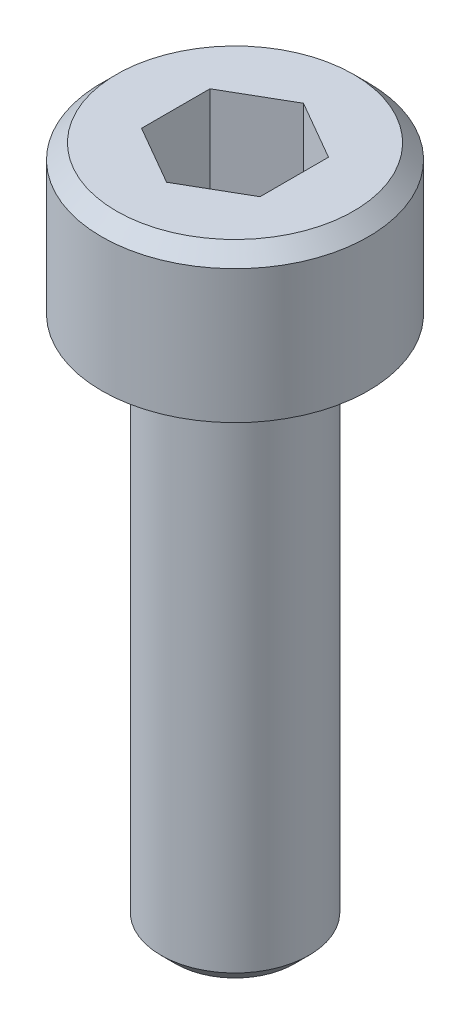
ISO-10303-21;
HEADER;
FILE_DESCRIPTION(('STEP AP214'),'2;1');
FILE_NAME('part.step','',(''),(''),'','','');
FILE_SCHEMA(('AUTOMOTIVE_DESIGN { 1 0 10303 214 1 1 1 1 }'));
ENDSEC;
DATA;
#1=APPLICATION_CONTEXT('core data for automotive mechanical design processes');
#2=APPLICATION_PROTOCOL_DEFINITION('international standard','automotive_design',2000,#1);
#3=PRODUCT_CONTEXT('',#1,'mechanical');
#4=PRODUCT('Part','Part','',(#3));
#5=PRODUCT_RELATED_PRODUCT_CATEGORY('part','',(#4));
#6=PRODUCT_DEFINITION_FORMATION('','',#4);
#7=PRODUCT_DEFINITION_CONTEXT('part definition',#1,'design');
#8=PRODUCT_DEFINITION('design','',#6,#7);
#9=PRODUCT_DEFINITION_SHAPE('','',#8);
#10=(LENGTH_UNIT() NAMED_UNIT(*) SI_UNIT(.MILLI.,.METRE.));
#11=(NAMED_UNIT(*) PLANE_ANGLE_UNIT() SI_UNIT($,.RADIAN.));
#12=(NAMED_UNIT(*) SI_UNIT($,.STERADIAN.) SOLID_ANGLE_UNIT());
#13=UNCERTAINTY_MEASURE_WITH_UNIT(LENGTH_MEASURE(1.E-05),#10,'distance_accuracy_value','');
#14=(GEOMETRIC_REPRESENTATION_CONTEXT(3) GLOBAL_UNCERTAINTY_ASSIGNED_CONTEXT((#13)) GLOBAL_UNIT_ASSIGNED_CONTEXT((#10,
#11,#12)) REPRESENTATION_CONTEXT('',''));
#15=CARTESIAN_POINT('',(0.,0.,0.));
#16=DIRECTION('',(0.,0.,1.));
#17=DIRECTION('',(1.,0.,0.));
#18=AXIS2_PLACEMENT_3D('',#15,#16,#17);
#19=CARTESIAN_POINT('',(0.,11.5,0.));
#20=DIRECTION('',(0.,-1.,0.));
#21=DIRECTION('',(0.,0.,-1.));
#22=AXIS2_PLACEMENT_3D('',#19,#20,#21);
#23=PLANE('',#22);
#24=CARTESIAN_POINT('',(0.,11.5,0.));
#25=DIRECTION('',(0.,-1.,0.));
#26=DIRECTION('',(0.,0.,-1.));
#27=AXIS2_PLACEMENT_3D('',#24,#25,#26);
#28=CIRCLE('',#27,4.);
#29=CARTESIAN_POINT('',(0.,11.5,-4.));
#30=VERTEX_POINT('',#29);
#31=EDGE_CURVE('E145',#30,#30,#28,.F.);
#32=ORIENTED_EDGE('',*,*,#31,.T.);
#33=EDGE_LOOP('',(#32));
#34=FACE_BOUND('',#33,.T.);
#35=DIRECTION('',(-0.866025403784439,0.,0.5));
#36=VECTOR('',#35,1.);
#37=CARTESIAN_POINT('',(0.,11.5,-2.3094010767585));
#38=LINE('',#37,#36);
#39=CARTESIAN_POINT('',(0.,11.5,-2.3094010767585));
#40=VERTEX_POINT('',#39);
#41=CARTESIAN_POINT('',(-2.,11.5,-1.15470053837925));
#42=VERTEX_POINT('',#41);
#43=EDGE_CURVE('E121',#40,#42,#38,.T.);
#44=ORIENTED_EDGE('',*,*,#43,.F.);
#45=DIRECTION('',(-0.866025403784439,0.,-0.5));
#46=VECTOR('',#45,1.);
#47=CARTESIAN_POINT('',(2.,11.5,-1.15470053837925));
#48=LINE('',#47,#46);
#49=CARTESIAN_POINT('',(2.,11.5,-1.15470053837925));
#50=VERTEX_POINT('',#49);
#51=EDGE_CURVE('E47',#50,#40,#48,.T.);
#52=ORIENTED_EDGE('',*,*,#51,.F.);
#53=DIRECTION('',(0.,0.,-1.));
#54=VECTOR('',#53,1.);
#55=CARTESIAN_POINT('',(2.,11.5,1.15470053837925));
#56=LINE('',#55,#54);
#57=CARTESIAN_POINT('',(2.,11.5,1.15470053837925));
#58=VERTEX_POINT('',#57);
#59=EDGE_CURVE('E130',#58,#50,#56,.T.);
#60=ORIENTED_EDGE('',*,*,#59,.F.);
#61=DIRECTION('',(0.866025403784439,0.,-0.5));
#62=VECTOR('',#61,1.);
#63=CARTESIAN_POINT('',(0.,11.5,2.3094010767585));
#64=LINE('',#63,#62);
#65=CARTESIAN_POINT('',(0.,11.5,2.3094010767585));
#66=VERTEX_POINT('',#65);
#67=EDGE_CURVE('E128',#66,#58,#64,.T.);
#68=ORIENTED_EDGE('',*,*,#67,.F.);
#69=DIRECTION('',(0.866025403784438,0.,0.5));
#70=VECTOR('',#69,1.);
#71=CARTESIAN_POINT('',(-2.,11.5,1.15470053837925));
#72=LINE('',#71,#70);
#73=CARTESIAN_POINT('',(-2.,11.5,1.15470053837925));
#74=VERTEX_POINT('',#73);
#75=EDGE_CURVE('E95',#74,#66,#72,.T.);
#76=ORIENTED_EDGE('',*,*,#75,.F.);
#77=DIRECTION('',(0.,0.,1.));
#78=VECTOR('',#77,1.);
#79=CARTESIAN_POINT('',(-2.,11.5,-1.15470053837925));
#80=LINE('',#79,#78);
#81=EDGE_CURVE('E124',#42,#74,#80,.T.);
#82=ORIENTED_EDGE('',*,*,#81,.F.);
#83=EDGE_LOOP('',(#44,#52,#60,#68,#76,#82));
#84=FACE_BOUND('',#83,.T.);
#85=ADVANCED_FACE('F32',(#34,#84),#23,.F.);
#86=CARTESIAN_POINT('',(0.,14.9184782608696,0.));
#87=DIRECTION('',(0.,1.,0.));
#88=DIRECTION('',(0.,0.,1.));
#89=AXIS2_PLACEMENT_3D('',#86,#87,#88);
#90=CYLINDRICAL_SURFACE('',#89,4.5);
#91=CARTESIAN_POINT('',(0.,11.,0.));
#92=DIRECTION('',(0.,-1.,0.));
#93=DIRECTION('',(0.,0.,-1.));
#94=AXIS2_PLACEMENT_3D('',#91,#92,#93);
#95=CIRCLE('',#94,4.5);
#96=CARTESIAN_POINT('',(0.,11.,-4.5));
#97=VERTEX_POINT('',#96);
#98=EDGE_CURVE('E148',#97,#97,#95,.T.);
#99=ORIENTED_EDGE('',*,*,#98,.T.);
#100=EDGE_LOOP('',(#99));
#101=FACE_BOUND('',#100,.T.);
#102=CARTESIAN_POINT('',(0.,6.5,0.));
#103=DIRECTION('',(0.,1.,0.));
#104=DIRECTION('',(0.,0.,1.));
#105=AXIS2_PLACEMENT_3D('',#102,#103,#104);
#106=CIRCLE('',#105,4.5);
#107=CARTESIAN_POINT('',(0.,6.5,4.5));
#108=VERTEX_POINT('',#107);
#109=EDGE_CURVE('E142',#108,#108,#106,.T.);
#110=ORIENTED_EDGE('',*,*,#109,.T.);
#111=EDGE_LOOP('',(#110));
#112=FACE_BOUND('',#111,.T.);
#113=ADVANCED_FACE('F165',(#101,#112),#90,.T.);
#114=CARTESIAN_POINT('',(4.5,6.5,0.));
#115=DIRECTION('',(0.,1.,0.));
#116=DIRECTION('',(0.,0.,1.));
#117=AXIS2_PLACEMENT_3D('',#114,#115,#116);
#118=PLANE('',#117);
#119=ORIENTED_EDGE('',*,*,#109,.F.);
#120=EDGE_LOOP('',(#119));
#121=FACE_BOUND('',#120,.T.);
#122=CARTESIAN_POINT('',(0.,6.5,0.));
#123=DIRECTION('',(0.,1.,0.));
#124=DIRECTION('',(0.,0.,1.));
#125=AXIS2_PLACEMENT_3D('',#122,#123,#124);
#126=CIRCLE('',#125,2.5);
#127=CARTESIAN_POINT('',(0.,6.5,2.5));
#128=VERTEX_POINT('',#127);
#129=EDGE_CURVE('E134',#128,#128,#126,.T.);
#130=ORIENTED_EDGE('',*,*,#129,.T.);
#131=EDGE_LOOP('',(#130));
#132=FACE_BOUND('',#131,.T.);
#133=ADVANCED_FACE('F171',(#121,#132),#118,.F.);
#134=CARTESIAN_POINT('',(0.,14.9184782608696,0.));
#135=DIRECTION('',(0.,1.,0.));
#136=DIRECTION('',(0.,0.,1.));
#137=AXIS2_PLACEMENT_3D('',#134,#135,#136);
#138=CYLINDRICAL_SURFACE('',#137,2.5);
#139=CARTESIAN_POINT('',(0.,-11.,0.));
#140=DIRECTION('',(0.,1.,0.));
#141=DIRECTION('',(0.,0.,1.));
#142=AXIS2_PLACEMENT_3D('',#139,#140,#141);
#143=CIRCLE('',#142,2.5);
#144=CARTESIAN_POINT('',(0.,-11.,2.5));
#145=VERTEX_POINT('',#144);
#146=EDGE_CURVE('E40',#145,#145,#143,.T.);
#147=ORIENTED_EDGE('',*,*,#146,.T.);
#148=EDGE_LOOP('',(#147));
#149=FACE_BOUND('',#148,.T.);
#150=ORIENTED_EDGE('',*,*,#129,.F.);
#151=EDGE_LOOP('',(#150));
#152=FACE_BOUND('',#151,.T.);
#153=ADVANCED_FACE('F153',(#149,#152),#138,.T.);
#154=CARTESIAN_POINT('',(2.5,-11.5,0.));
#155=DIRECTION('',(0.,1.,0.));
#156=DIRECTION('',(0.,0.,1.));
#157=AXIS2_PLACEMENT_3D('',#154,#155,#156);
#158=PLANE('',#157);
#159=CARTESIAN_POINT('',(0.,-11.5,0.));
#160=DIRECTION('',(0.,1.,0.));
#161=DIRECTION('',(0.,0.,1.));
#162=AXIS2_PLACEMENT_3D('',#159,#160,#161);
#163=CIRCLE('',#162,1.99999999999999);
#164=CARTESIAN_POINT('',(0.,-11.5,1.99999999999999));
#165=VERTEX_POINT('',#164);
#166=EDGE_CURVE('E11',#165,#165,#163,.F.);
#167=ORIENTED_EDGE('',*,*,#166,.T.);
#168=EDGE_LOOP('',(#167));
#169=FACE_BOUND('',#168,.T.);
#170=ADVANCED_FACE('F181',(#169),#158,.F.);
#171=CARTESIAN_POINT('',(2.,7.5,-1.15470053837925));
#172=DIRECTION('',(0.5,0.,-0.866025403784439));
#173=DIRECTION('',(-0.866025403784439,0.,-0.5));
#174=AXIS2_PLACEMENT_3D('',#171,#172,#173);
#175=PLANE('',#174);
#176=ORIENTED_EDGE('',*,*,#51,.T.);
#177=DIRECTION('',(0.,1.,0.));
#178=VECTOR('',#177,1.);
#179=CARTESIAN_POINT('',(0.,7.5,-2.3094010767585));
#180=LINE('',#179,#178);
#181=CARTESIAN_POINT('',(0.,7.5,-2.3094010767585));
#182=VERTEX_POINT('',#181);
#183=EDGE_CURVE('E77',#182,#40,#180,.T.);
#184=ORIENTED_EDGE('',*,*,#183,.F.);
#185=DIRECTION('',(-0.866025403784439,0.,-0.5));
#186=VECTOR('',#185,1.);
#187=CARTESIAN_POINT('',(2.,7.5,-1.15470053837925));
#188=LINE('',#187,#186);
#189=CARTESIAN_POINT('',(2.,7.5,-1.15470053837925));
#190=VERTEX_POINT('',#189);
#191=EDGE_CURVE('E132',#190,#182,#188,.T.);
#192=ORIENTED_EDGE('',*,*,#191,.F.);
#193=DIRECTION('',(0.,1.,0.));
#194=VECTOR('',#193,1.);
#195=CARTESIAN_POINT('',(2.,7.5,-1.15470053837925));
#196=LINE('',#195,#194);
#197=EDGE_CURVE('E55',#190,#50,#196,.T.);
#198=ORIENTED_EDGE('',*,*,#197,.T.);
#199=EDGE_LOOP('',(#176,#184,#192,#198));
#200=FACE_BOUND('',#199,.T.);
#201=ADVANCED_FACE('F184',(#200),#175,.F.);
#202=CARTESIAN_POINT('',(2.,7.5,1.15470053837925));
#203=DIRECTION('',(1.,0.,0.));
#204=DIRECTION('',(0.,0.,-1.));
#205=AXIS2_PLACEMENT_3D('',#202,#203,#204);
#206=PLANE('',#205);
#207=ORIENTED_EDGE('',*,*,#59,.T.);
#208=ORIENTED_EDGE('',*,*,#197,.F.);
#209=DIRECTION('',(0.,0.,-1.));
#210=VECTOR('',#209,1.);
#211=CARTESIAN_POINT('',(2.,7.5,1.15470053837925));
#212=LINE('',#211,#210);
#213=CARTESIAN_POINT('',(2.,7.5,1.15470053837925));
#214=VERTEX_POINT('',#213);
#215=EDGE_CURVE('E107',#214,#190,#212,.T.);
#216=ORIENTED_EDGE('',*,*,#215,.F.);
#217=DIRECTION('',(0.,1.,0.));
#218=VECTOR('',#217,1.);
#219=CARTESIAN_POINT('',(2.,7.5,1.15470053837925));
#220=LINE('',#219,#218);
#221=EDGE_CURVE('E99',#214,#58,#220,.T.);
#222=ORIENTED_EDGE('',*,*,#221,.T.);
#223=EDGE_LOOP('',(#207,#208,#216,#222));
#224=FACE_BOUND('',#223,.T.);
#225=ADVANCED_FACE('F188',(#224),#206,.F.);
#226=CARTESIAN_POINT('',(0.,7.5,2.3094010767585));
#227=DIRECTION('',(0.5,0.,0.866025403784439));
#228=DIRECTION('',(0.866025403784439,0.,-0.5));
#229=AXIS2_PLACEMENT_3D('',#226,#227,#228);
#230=PLANE('',#229);
#231=ORIENTED_EDGE('',*,*,#67,.T.);
#232=ORIENTED_EDGE('',*,*,#221,.F.);
#233=DIRECTION('',(0.866025403784439,0.,-0.5));
#234=VECTOR('',#233,1.);
#235=CARTESIAN_POINT('',(0.,7.5,2.3094010767585));
#236=LINE('',#235,#234);
#237=CARTESIAN_POINT('',(0.,7.5,2.3094010767585));
#238=VERTEX_POINT('',#237);
#239=EDGE_CURVE('E103',#238,#214,#236,.T.);
#240=ORIENTED_EDGE('',*,*,#239,.F.);
#241=DIRECTION('',(0.,1.,0.));
#242=VECTOR('',#241,1.);
#243=CARTESIAN_POINT('',(0.,7.5,2.3094010767585));
#244=LINE('',#243,#242);
#245=EDGE_CURVE('E88',#238,#66,#244,.T.);
#246=ORIENTED_EDGE('',*,*,#245,.T.);
#247=EDGE_LOOP('',(#231,#232,#240,#246));
#248=FACE_BOUND('',#247,.T.);
#249=ADVANCED_FACE('F104',(#248),#230,.F.);
#250=CARTESIAN_POINT('',(-2.,7.5,1.15470053837925));
#251=DIRECTION('',(-0.5,0.,0.866025403784438));
#252=DIRECTION('',(0.866025403784438,0.,0.5));
#253=AXIS2_PLACEMENT_3D('',#250,#251,#252);
#254=PLANE('',#253);
#255=ORIENTED_EDGE('',*,*,#75,.T.);
#256=ORIENTED_EDGE('',*,*,#245,.F.);
#257=DIRECTION('',(0.866025403784438,0.,0.5));
#258=VECTOR('',#257,1.);
#259=CARTESIAN_POINT('',(-2.,7.5,1.15470053837925));
#260=LINE('',#259,#258);
#261=CARTESIAN_POINT('',(-2.,7.5,1.15470053837925));
#262=VERTEX_POINT('',#261);
#263=EDGE_CURVE('E92',#262,#238,#260,.T.);
#264=ORIENTED_EDGE('',*,*,#263,.F.);
#265=DIRECTION('',(0.,1.,0.));
#266=VECTOR('',#265,1.);
#267=CARTESIAN_POINT('',(-2.,7.5,1.15470053837925));
#268=LINE('',#267,#266);
#269=EDGE_CURVE('E100',#262,#74,#268,.T.);
#270=ORIENTED_EDGE('',*,*,#269,.T.);
#271=EDGE_LOOP('',(#255,#256,#264,#270));
#272=FACE_BOUND('',#271,.T.);
#273=ADVANCED_FACE('F90',(#272),#254,.F.);
#274=CARTESIAN_POINT('',(-2.,7.5,-1.15470053837925));
#275=DIRECTION('',(-1.,0.,0.));
#276=DIRECTION('',(0.,0.,1.));
#277=AXIS2_PLACEMENT_3D('',#274,#275,#276);
#278=PLANE('',#277);
#279=ORIENTED_EDGE('',*,*,#81,.T.);
#280=ORIENTED_EDGE('',*,*,#269,.F.);
#281=DIRECTION('',(0.,0.,1.));
#282=VECTOR('',#281,1.);
#283=CARTESIAN_POINT('',(-2.,7.5,-1.15470053837925));
#284=LINE('',#283,#282);
#285=CARTESIAN_POINT('',(-2.,7.5,-1.15470053837925));
#286=VERTEX_POINT('',#285);
#287=EDGE_CURVE('E113',#286,#262,#284,.T.);
#288=ORIENTED_EDGE('',*,*,#287,.F.);
#289=DIRECTION('',(0.,1.,0.));
#290=VECTOR('',#289,1.);
#291=CARTESIAN_POINT('',(-2.,7.5,-1.15470053837925));
#292=LINE('',#291,#290);
#293=EDGE_CURVE('E137',#286,#42,#292,.T.);
#294=ORIENTED_EDGE('',*,*,#293,.T.);
#295=EDGE_LOOP('',(#279,#280,#288,#294));
#296=FACE_BOUND('',#295,.T.);
#297=ADVANCED_FACE('F192',(#296),#278,.F.);
#298=CARTESIAN_POINT('',(0.,7.5,-2.3094010767585));
#299=DIRECTION('',(-0.5,0.,-0.866025403784439));
#300=DIRECTION('',(-0.866025403784439,0.,0.5));
#301=AXIS2_PLACEMENT_3D('',#298,#299,#300);
#302=PLANE('',#301);
#303=ORIENTED_EDGE('',*,*,#43,.T.);
#304=ORIENTED_EDGE('',*,*,#293,.F.);
#305=DIRECTION('',(-0.866025403784439,0.,0.5));
#306=VECTOR('',#305,1.);
#307=CARTESIAN_POINT('',(0.,7.5,-2.3094010767585));
#308=LINE('',#307,#306);
#309=EDGE_CURVE('E115',#182,#286,#308,.T.);
#310=ORIENTED_EDGE('',*,*,#309,.F.);
#311=ORIENTED_EDGE('',*,*,#183,.T.);
#312=EDGE_LOOP('',(#303,#304,#310,#311));
#313=FACE_BOUND('',#312,.T.);
#314=ADVANCED_FACE('F189',(#313),#302,.F.);
#315=CARTESIAN_POINT('',(0.,7.5,0.));
#316=DIRECTION('',(0.,1.,0.));
#317=DIRECTION('',(0.,0.,1.));
#318=AXIS2_PLACEMENT_3D('',#315,#316,#317);
#319=PLANE('',#318);
#320=ORIENTED_EDGE('',*,*,#191,.T.);
#321=ORIENTED_EDGE('',*,*,#309,.T.);
#322=ORIENTED_EDGE('',*,*,#287,.T.);
#323=ORIENTED_EDGE('',*,*,#263,.T.);
#324=ORIENTED_EDGE('',*,*,#239,.T.);
#325=ORIENTED_EDGE('',*,*,#215,.T.);
#326=EDGE_LOOP('',(#320,#321,#322,#323,#324,#325));
#327=FACE_BOUND('',#326,.T.);
#328=ADVANCED_FACE('F110',(#327),#319,.T.);
#329=CARTESIAN_POINT('',(0.,11.5,0.));
#330=DIRECTION('',(0.,-1.,0.));
#331=DIRECTION('',(0.,0.,-1.));
#332=AXIS2_PLACEMENT_3D('',#329,#330,#331);
#333=CONICAL_SURFACE('',#332,4.,0.785398163397447);
#334=ORIENTED_EDGE('',*,*,#98,.F.);
#335=EDGE_LOOP('',(#334));
#336=FACE_BOUND('',#335,.T.);
#337=ORIENTED_EDGE('',*,*,#31,.F.);
#338=EDGE_LOOP('',(#337));
#339=FACE_BOUND('',#338,.T.);
#340=ADVANCED_FACE('F157',(#336,#339),#333,.T.);
#341=CARTESIAN_POINT('',(0.,-11.,0.));
#342=DIRECTION('',(0.,1.,0.));
#343=DIRECTION('',(0.,0.,1.));
#344=AXIS2_PLACEMENT_3D('',#341,#342,#343);
#345=CONICAL_SURFACE('',#344,2.5,0.785398163397448);
#346=ORIENTED_EDGE('',*,*,#166,.F.);
#347=EDGE_LOOP('',(#346));
#348=FACE_BOUND('',#347,.T.);
#349=ORIENTED_EDGE('',*,*,#146,.F.);
#350=EDGE_LOOP('',(#349));
#351=FACE_BOUND('',#350,.T.);
#352=ADVANCED_FACE('F34',(#348,#351),#345,.T.);
#353=CLOSED_SHELL('',(#85,#113,#133,#153,#170,#201,#225,#249,#273,#297,#314,#328,#340,#352));
#354=MANIFOLD_SOLID_BREP('B2',#353);
#355=ADVANCED_BREP_SHAPE_REPRESENTATION('',(#18,#354),#14);
#356=SHAPE_DEFINITION_REPRESENTATION(#9,#355);
ENDSEC;
END-ISO-10303-21;
